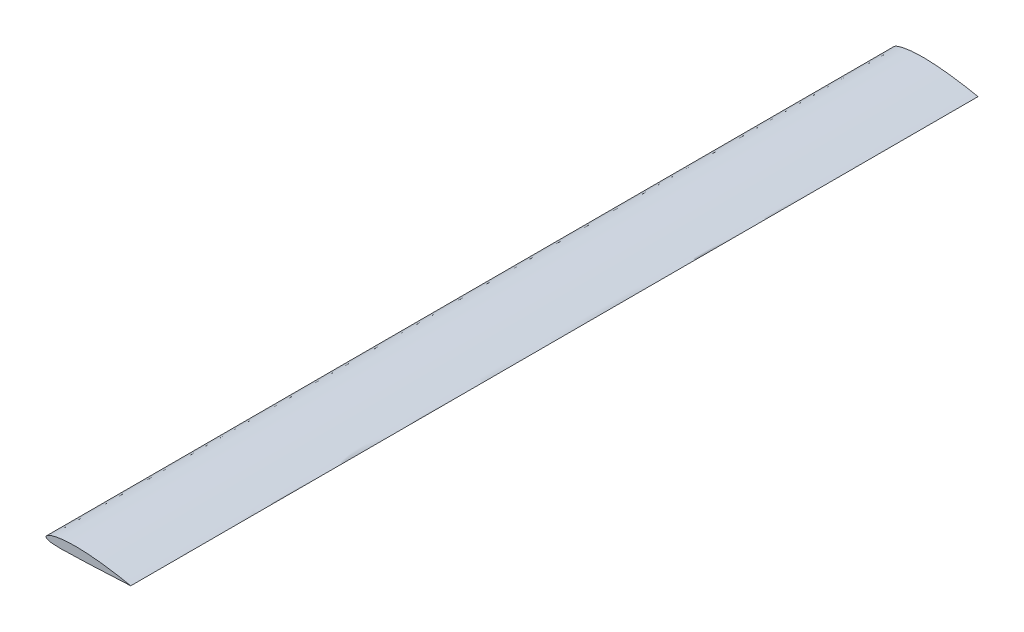
ISO-10303-21;
HEADER;
FILE_DESCRIPTION(('STEP AP214'),'2;1');
FILE_NAME('part.step','',(''),(''),'','','');
FILE_SCHEMA(('AUTOMOTIVE_DESIGN { 1 0 10303 214 1 1 1 1 }'));
ENDSEC;
DATA;
#1=APPLICATION_CONTEXT('core data for automotive mechanical design processes');
#2=APPLICATION_PROTOCOL_DEFINITION('international standard','automotive_design',2000,#1);
#3=PRODUCT_CONTEXT('',#1,'mechanical');
#4=PRODUCT('Part','Part','',(#3));
#5=PRODUCT_RELATED_PRODUCT_CATEGORY('part','',(#4));
#6=PRODUCT_DEFINITION_FORMATION('','',#4);
#7=PRODUCT_DEFINITION_CONTEXT('part definition',#1,'design');
#8=PRODUCT_DEFINITION('design','',#6,#7);
#9=PRODUCT_DEFINITION_SHAPE('','',#8);
#10=(LENGTH_UNIT() NAMED_UNIT(*) SI_UNIT(.MILLI.,.METRE.));
#11=(NAMED_UNIT(*) PLANE_ANGLE_UNIT() SI_UNIT($,.RADIAN.));
#12=(NAMED_UNIT(*) SI_UNIT($,.STERADIAN.) SOLID_ANGLE_UNIT());
#13=UNCERTAINTY_MEASURE_WITH_UNIT(LENGTH_MEASURE(1.E-05),#10,'distance_accuracy_value','');
#14=(GEOMETRIC_REPRESENTATION_CONTEXT(3) GLOBAL_UNCERTAINTY_ASSIGNED_CONTEXT((#13)) GLOBAL_UNIT_ASSIGNED_CONTEXT((#10,
#11,#12)) REPRESENTATION_CONTEXT('',''));
#15=CARTESIAN_POINT('',(0.,0.,0.));
#16=DIRECTION('',(0.,0.,1.));
#17=DIRECTION('',(1.,0.,0.));
#18=AXIS2_PLACEMENT_3D('',#15,#16,#17);
#19=CARTESIAN_POINT('',(1000.,0.,5000.));
#20=CARTESIAN_POINT('',(1000.00873257527,0.119934672892633,5000.));
#21=CARTESIAN_POINT('',(994.187328474784,1.09578473056597,5000.));
#22=CARTESIAN_POINT('',(988.251348446331,2.66527886474239,5000.));
#23=CARTESIAN_POINT('',(973.684466482534,5.60555236233422,5000.));
#24=CARTESIAN_POINT('',(955.704193065114,9.406804905335,5000.));
#25=CARTESIAN_POINT('',(932.033845608995,14.1488212529839,5000.));
#26=CARTESIAN_POINT('',(903.907868572512,19.5858490316157,5000.));
#27=CARTESIAN_POINT('',(871.265367885657,25.6200944041575,5000.));
#28=CARTESIAN_POINT('',(834.559796688509,32.0251010313819,5000.));
#29=CARTESIAN_POINT('',(794.153237064793,38.6350080869235,5000.));
#30=CARTESIAN_POINT('',(750.483589178281,45.284490242194,5000.));
#31=CARTESIAN_POINT('',(704.028186517578,51.7820421588533,5000.));
#32=CARTESIAN_POINT('',(655.278036722717,57.9526189490698,5000.));
#33=CARTESIAN_POINT('',(604.766905697045,63.6366544145649,5000.));
#34=CARTESIAN_POINT('',(553.0450392436,68.6796164971388,5000.));
#35=CARTESIAN_POINT('',(500.68713982767,72.9184853512992,5000.));
#36=CARTESIAN_POINT('',(448.263577724424,76.2071679660907,5000.));
#37=CARTESIAN_POINT('',(396.218468620485,78.5322928437807,5000.));
#38=CARTESIAN_POINT('',(345.123763577356,79.3940251537224,5000.));
#39=CARTESIAN_POINT('',(295.588546699978,78.6173765015092,5000.));
#40=CARTESIAN_POINT('',(248.347738408339,76.2262806523031,5000.));
#41=CARTESIAN_POINT('',(203.946254758998,72.3334272921332,5000.));
#42=CARTESIAN_POINT('',(162.919560592164,67.0588468511511,5000.));
#43=CARTESIAN_POINT('',(125.725576031294,60.6170892612131,5000.));
#44=CARTESIAN_POINT('',(92.8129750190164,53.1875016187459,5000.));
#45=CARTESIAN_POINT('',(64.5204920584178,45.0612146489312,5000.));
#46=CARTESIAN_POINT('',(41.1467372622812,36.4646351668945,5000.));
#47=CARTESIAN_POINT('',(22.8256966101811,27.7014478571071,5000.));
#48=CARTESIAN_POINT('',(9.69966667333233,18.8455583427639,5000.));
#49=CARTESIAN_POINT('',(1.40290371987757,9.92248126392543,5000.));
#50=CARTESIAN_POINT('',(-1.11984118995943,-0.134704317051223,5000.));
#51=CARTESIAN_POINT('',(3.75655155411474,-9.27363119049476,5000.));
#52=CARTESIAN_POINT('',(13.896645859391,-15.9024515956001,5000.));
#53=CARTESIAN_POINT('',(28.549172986009,-21.4362626721132,5000.));
#54=CARTESIAN_POINT('',(48.0456883580756,-25.8880277594243,5000.));
#55=CARTESIAN_POINT('',(72.211329883013,-29.3444416391281,5000.));
#56=CARTESIAN_POINT('',(100.84569449626,-31.8081399693704,5000.));
#57=CARTESIAN_POINT('',(133.643960931574,-33.3056915212717,5000.));
#58=CARTESIAN_POINT('',(170.270650663302,-33.9336288896047,5000.));
#59=CARTESIAN_POINT('',(210.333575174663,-33.7719215882891,5000.));
#60=CARTESIAN_POINT('',(253.434927086511,-32.956870103987,5000.));
#61=CARTESIAN_POINT('',(299.134351362387,-31.6768056975617,5000.));
#62=CARTESIAN_POINT('',(346.987948532427,-30.0364714814026,5000.));
#63=CARTESIAN_POINT('',(396.64868013072,-28.2966642301059,5000.));
#64=CARTESIAN_POINT('',(447.622383274189,-26.415912735245,5000.));
#65=CARTESIAN_POINT('',(499.354094900167,-24.1774422876795,5000.));
#66=CARTESIAN_POINT('',(551.152474124734,-21.7654698222881,5000.));
#67=CARTESIAN_POINT('',(602.440968268876,-19.2731532110285,5000.));
#68=CARTESIAN_POINT('',(652.66032774651,-16.7997385099487,5000.));
#69=CARTESIAN_POINT('',(701.26585953787,-14.3878256400446,5000.));
#70=CARTESIAN_POINT('',(747.72341066967,-12.1250391088599,5000.));
#71=CARTESIAN_POINT('',(791.51871414999,-9.98442889640767,5000.));
#72=CARTESIAN_POINT('',(832.158044684101,-8.03527735241781,5000.));
#73=CARTESIAN_POINT('',(869.187695267133,-6.27408752912168,5000.));
#74=CARTESIAN_POINT('',(902.21442085822,-4.7020463528656,5000.));
#75=CARTESIAN_POINT('',(930.744197997258,-3.33301569013,5000.));
#76=CARTESIAN_POINT('',(954.81083372549,-2.20323361403243,5000.));
#77=CARTESIAN_POINT('',(973.1424788107,-1.24994133511499,5000.));
#78=CARTESIAN_POINT('',(987.981344419142,-0.705718229582762,5000.));
#79=CARTESIAN_POINT('',(994.084917377338,-0.103818703741406,5000.));
#80=CARTESIAN_POINT('',(999.99123792049,-0.120339889203783,5000.));
#81=CARTESIAN_POINT('',(1000.,0.,5000.));
#82=B_SPLINE_CURVE_WITH_KNOTS('',3,(#19,#20,#21,#22,#23,#24,#25,#26,#27,#28,#29,#30,#31,#32,#33,
#34,#35,#36,#37,#38,#39,#40,#41,#42,#43,#44,#45,#46,#47,#48,#49,#50,#51,#52,#53,#54,#55,#56,#57,
#58,#59,#60,#61,#62,#63,#64,#65,#66,#67,#68,#69,#70,#71,#72,#73,#74,#75,#76,#77,#78,#79,#80,
#81),.UNSPECIFIED.,.T.,.F.,(4,1,1,1,1,1,1,1,1,1,1,1,1,1,1,1,1,1,1,1,1,1,1,1,1,1,1,1,1,1,1,1,1,1,
1,1,1,1,1,1,1,1,1,1,1,1,1,1,1,1,1,1,1,1,1,1,1,1,1,1,4),(0.,0.00135670370844239,
0.00543536433192116,0.0121605492756754,0.0214762075917581,0.0332687277803089,0.0474183040673037,
0.0637672749571287,0.0821205636929844,0.102301325549067,0.124060298779779,0.147173611261475,
0.171379883661588,0.196425271293832,0.222028151060924,0.247908738314017,0.273780803854396,
0.29938028084808,0.324625528193636,0.349026459448461,0.372325639535006,0.3942712143622,
0.414650832074864,0.433225344147141,0.4498414009907,0.464318215416284,0.476543577320535,
0.486486469274256,0.494145335681348,0.499780476001817,0.50409544384546,0.508406033782502,
0.514028803821191,0.521614067313217,0.531408239999712,0.543410467930138,0.557546309678965,
0.57371574384555,0.591754561601713,0.611488784128563,0.6327137234909,0.655239764336124,
0.67881601391235,0.703228825001902,0.728419959779748,0.753935639962732,0.779484896279643,
0.804785932090968,0.829557187319402,0.853532458471379,0.876455339088627,0.898055920575666,
0.918107706202647,0.936370202960377,0.952661985494619,0.96676683569805,0.978537417748831,
0.987850677746866,0.994569086882588,0.998638712475562,1.),.UNSPECIFIED.);
#83=DIRECTION('',(0.,0.,-1.));
#84=VECTOR('',#83,1.);
#85=SURFACE_OF_LINEAR_EXTRUSION('',#82,#84);
#86=CARTESIAN_POINT('',(1000.,0.,5000.));
#87=VERTEX_POINT('',#86);
#88=EDGE_CURVE('E10',#87,#87,#82,.T.);
#89=ORIENTED_EDGE('',*,*,#88,.F.);
#90=EDGE_LOOP('',(#89));
#91=FACE_BOUND('',#90,.T.);
#92=CARTESIAN_POINT('',(1000.,0.,-5000.));
#93=CARTESIAN_POINT('',(1000.00873257527,0.119934672892633,-5000.));
#94=CARTESIAN_POINT('',(994.187328474784,1.09578473056597,-5000.));
#95=CARTESIAN_POINT('',(988.251348446331,2.66527886474239,-5000.));
#96=CARTESIAN_POINT('',(973.684466482534,5.60555236233422,-5000.));
#97=CARTESIAN_POINT('',(955.704193065114,9.406804905335,-5000.));
#98=CARTESIAN_POINT('',(932.033845608995,14.1488212529839,-5000.));
#99=CARTESIAN_POINT('',(903.907868572512,19.5858490316157,-5000.));
#100=CARTESIAN_POINT('',(871.265367885657,25.6200944041575,-5000.));
#101=CARTESIAN_POINT('',(834.559796688509,32.0251010313819,-5000.));
#102=CARTESIAN_POINT('',(794.153237064793,38.6350080869235,-5000.));
#103=CARTESIAN_POINT('',(750.483589178281,45.284490242194,-5000.));
#104=CARTESIAN_POINT('',(704.028186517578,51.7820421588533,-5000.));
#105=CARTESIAN_POINT('',(655.278036722717,57.9526189490698,-5000.));
#106=CARTESIAN_POINT('',(604.766905697045,63.6366544145649,-5000.));
#107=CARTESIAN_POINT('',(553.0450392436,68.6796164971388,-5000.));
#108=CARTESIAN_POINT('',(500.68713982767,72.9184853512992,-5000.));
#109=CARTESIAN_POINT('',(448.263577724424,76.2071679660907,-5000.));
#110=CARTESIAN_POINT('',(396.218468620485,78.5322928437807,-5000.));
#111=CARTESIAN_POINT('',(345.123763577356,79.3940251537224,-5000.));
#112=CARTESIAN_POINT('',(295.588546699978,78.6173765015092,-5000.));
#113=CARTESIAN_POINT('',(248.347738408339,76.2262806523031,-5000.));
#114=CARTESIAN_POINT('',(203.946254758998,72.3334272921332,-5000.));
#115=CARTESIAN_POINT('',(162.919560592164,67.0588468511511,-5000.));
#116=CARTESIAN_POINT('',(125.725576031294,60.6170892612131,-5000.));
#117=CARTESIAN_POINT('',(92.8129750190164,53.1875016187459,-5000.));
#118=CARTESIAN_POINT('',(64.5204920584178,45.0612146489312,-5000.));
#119=CARTESIAN_POINT('',(41.1467372622812,36.4646351668945,-5000.));
#120=CARTESIAN_POINT('',(22.8256966101811,27.7014478571071,-5000.));
#121=CARTESIAN_POINT('',(9.69966667333233,18.8455583427639,-5000.));
#122=CARTESIAN_POINT('',(1.40290371987757,9.92248126392543,-5000.));
#123=CARTESIAN_POINT('',(-1.11984118995943,-0.134704317051223,-5000.));
#124=CARTESIAN_POINT('',(3.75655155411474,-9.27363119049476,-5000.));
#125=CARTESIAN_POINT('',(13.896645859391,-15.9024515956001,-5000.));
#126=CARTESIAN_POINT('',(28.549172986009,-21.4362626721132,-5000.));
#127=CARTESIAN_POINT('',(48.0456883580756,-25.8880277594243,-5000.));
#128=CARTESIAN_POINT('',(72.211329883013,-29.3444416391281,-5000.));
#129=CARTESIAN_POINT('',(100.84569449626,-31.8081399693704,-5000.));
#130=CARTESIAN_POINT('',(133.643960931574,-33.3056915212717,-5000.));
#131=CARTESIAN_POINT('',(170.270650663302,-33.9336288896047,-5000.));
#132=CARTESIAN_POINT('',(210.333575174663,-33.7719215882891,-5000.));
#133=CARTESIAN_POINT('',(253.434927086511,-32.956870103987,-5000.));
#134=CARTESIAN_POINT('',(299.134351362387,-31.6768056975617,-5000.));
#135=CARTESIAN_POINT('',(346.987948532427,-30.0364714814026,-5000.));
#136=CARTESIAN_POINT('',(396.64868013072,-28.2966642301059,-5000.));
#137=CARTESIAN_POINT('',(447.622383274189,-26.415912735245,-5000.));
#138=CARTESIAN_POINT('',(499.354094900167,-24.1774422876795,-5000.));
#139=CARTESIAN_POINT('',(551.152474124734,-21.7654698222881,-5000.));
#140=CARTESIAN_POINT('',(602.440968268876,-19.2731532110285,-5000.));
#141=CARTESIAN_POINT('',(652.66032774651,-16.7997385099487,-5000.));
#142=CARTESIAN_POINT('',(701.26585953787,-14.3878256400446,-5000.));
#143=CARTESIAN_POINT('',(747.72341066967,-12.1250391088599,-5000.));
#144=CARTESIAN_POINT('',(791.51871414999,-9.98442889640767,-5000.));
#145=CARTESIAN_POINT('',(832.158044684101,-8.03527735241781,-5000.));
#146=CARTESIAN_POINT('',(869.187695267133,-6.27408752912168,-5000.));
#147=CARTESIAN_POINT('',(902.21442085822,-4.7020463528656,-5000.));
#148=CARTESIAN_POINT('',(930.744197997258,-3.33301569013,-5000.));
#149=CARTESIAN_POINT('',(954.81083372549,-2.20323361403243,-5000.));
#150=CARTESIAN_POINT('',(973.1424788107,-1.24994133511499,-5000.));
#151=CARTESIAN_POINT('',(987.981344419142,-0.705718229582762,-5000.));
#152=CARTESIAN_POINT('',(994.084917377338,-0.103818703741406,-5000.));
#153=CARTESIAN_POINT('',(999.99123792049,-0.120339889203783,-5000.));
#154=CARTESIAN_POINT('',(1000.,0.,-5000.));
#155=B_SPLINE_CURVE_WITH_KNOTS('',3,(#92,#93,#94,#95,#96,#97,#98,#99,#100,#101,#102,#103,#104,
#105,#106,#107,#108,#109,#110,#111,#112,#113,#114,#115,#116,#117,#118,#119,#120,#121,#122,#123,
#124,#125,#126,#127,#128,#129,#130,#131,#132,#133,#134,#135,#136,#137,#138,#139,#140,#141,#142,
#143,#144,#145,#146,#147,#148,#149,#150,#151,#152,#153,#154),.UNSPECIFIED.,.T.,.F.,(4,1,1,1,1,1,
1,1,1,1,1,1,1,1,1,1,1,1,1,1,1,1,1,1,1,1,1,1,1,1,1,1,1,1,1,1,1,1,1,1,1,1,1,1,1,1,1,1,1,1,1,1,1,1,
1,1,1,1,1,1,4),(0.,0.00135670370844239,0.00543536433192116,0.0121605492756754,
0.0214762075917581,0.0332687277803089,0.0474183040673037,0.0637672749571287,0.0821205636929844,
0.102301325549067,0.124060298779779,0.147173611261475,0.171379883661588,0.196425271293832,
0.222028151060924,0.247908738314017,0.273780803854396,0.29938028084808,0.324625528193636,
0.349026459448461,0.372325639535006,0.3942712143622,0.414650832074864,0.433225344147141,
0.4498414009907,0.464318215416284,0.476543577320535,0.486486469274256,0.494145335681348,
0.499780476001817,0.50409544384546,0.508406033782502,0.514028803821191,0.521614067313217,
0.531408239999712,0.543410467930138,0.557546309678965,0.57371574384555,0.591754561601713,
0.611488784128563,0.6327137234909,0.655239764336124,0.67881601391235,0.703228825001902,
0.728419959779748,0.753935639962732,0.779484896279643,0.804785932090968,0.829557187319402,
0.853532458471379,0.876455339088627,0.898055920575666,0.918107706202647,0.936370202960377,
0.952661985494619,0.96676683569805,0.978537417748831,0.987850677746866,0.994569086882588,
0.998638712475562,1.),.UNSPECIFIED.);
#156=CARTESIAN_POINT('',(1000.,0.,-5000.));
#157=VERTEX_POINT('',#156);
#158=EDGE_CURVE('E47',#157,#157,#155,.T.);
#159=ORIENTED_EDGE('',*,*,#158,.T.);
#160=EDGE_LOOP('',(#159));
#161=FACE_BOUND('',#160,.T.);
#162=ADVANCED_FACE('F43',(#91,#161),#85,.F.);
#163=CARTESIAN_POINT('',(1.5238069631955,8.20942476428477,5000.));
#164=DIRECTION('',(0.,0.,-1.));
#165=DIRECTION('',(-1.,0.,0.));
#166=AXIS2_PLACEMENT_3D('',#163,#164,#165);
#167=PLANE('',#166);
#168=ORIENTED_EDGE('',*,*,#88,.T.);
#169=EDGE_LOOP('',(#168));
#170=FACE_BOUND('',#169,.T.);
#171=ADVANCED_FACE('F66',(#170),#167,.F.);
#172=CARTESIAN_POINT('',(1.5238069631955,8.20942476428477,-5000.));
#173=DIRECTION('',(0.,0.,-1.));
#174=DIRECTION('',(-1.,0.,0.));
#175=AXIS2_PLACEMENT_3D('',#172,#173,#174);
#176=PLANE('',#175);
#177=ORIENTED_EDGE('',*,*,#158,.F.);
#178=EDGE_LOOP('',(#177));
#179=FACE_BOUND('',#178,.T.);
#180=ADVANCED_FACE('F64',(#179),#176,.T.);
#181=CLOSED_SHELL('',(#162,#171,#180));
#182=MANIFOLD_SOLID_BREP('B2',#181);
#183=ADVANCED_BREP_SHAPE_REPRESENTATION('',(#18,#182),#14);
#184=SHAPE_DEFINITION_REPRESENTATION(#9,#183);
ENDSEC;
END-ISO-10303-21;
